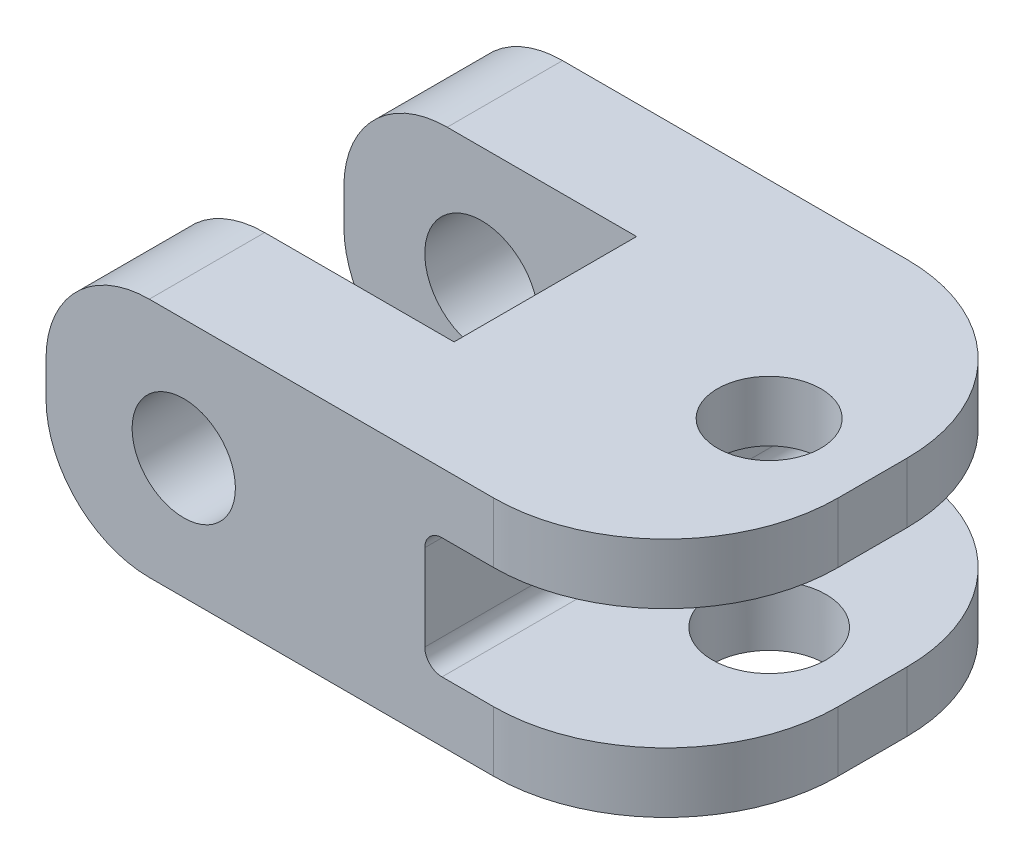
ISO-10303-21;
HEADER;
FILE_DESCRIPTION(('STEP AP214'),'2;1');
FILE_NAME('part.step','',(''),(''),'','','');
FILE_SCHEMA(('AUTOMOTIVE_DESIGN { 1 0 10303 214 1 1 1 1 }'));
ENDSEC;
DATA;
#1=APPLICATION_CONTEXT('core data for automotive mechanical design processes');
#2=APPLICATION_PROTOCOL_DEFINITION('international standard','automotive_design',2000,#1);
#3=PRODUCT_CONTEXT('',#1,'mechanical');
#4=PRODUCT('Part','Part','',(#3));
#5=PRODUCT_RELATED_PRODUCT_CATEGORY('part','',(#4));
#6=PRODUCT_DEFINITION_FORMATION('','',#4);
#7=PRODUCT_DEFINITION_CONTEXT('part definition',#1,'design');
#8=PRODUCT_DEFINITION('design','',#6,#7);
#9=PRODUCT_DEFINITION_SHAPE('','',#8);
#10=(LENGTH_UNIT() NAMED_UNIT(*) SI_UNIT(.MILLI.,.METRE.));
#11=(NAMED_UNIT(*) PLANE_ANGLE_UNIT() SI_UNIT($,.RADIAN.));
#12=(NAMED_UNIT(*) SI_UNIT($,.STERADIAN.) SOLID_ANGLE_UNIT());
#13=UNCERTAINTY_MEASURE_WITH_UNIT(LENGTH_MEASURE(1.E-05),#10,'distance_accuracy_value','');
#14=(GEOMETRIC_REPRESENTATION_CONTEXT(3) GLOBAL_UNCERTAINTY_ASSIGNED_CONTEXT((#13)) GLOBAL_UNIT_ASSIGNED_CONTEXT((#10,
#11,#12)) REPRESENTATION_CONTEXT('',''));
#15=CARTESIAN_POINT('',(0.,0.,0.));
#16=DIRECTION('',(0.,0.,1.));
#17=DIRECTION('',(1.,0.,0.));
#18=AXIS2_PLACEMENT_3D('',#15,#16,#17);
#19=CARTESIAN_POINT('',(9.,3.5,12.));
#20=DIRECTION('',(-1.,0.,0.));
#21=DIRECTION('',(0.,0.,1.));
#22=AXIS2_PLACEMENT_3D('',#19,#20,#21);
#23=PLANE('',#22);
#24=DIRECTION('',(0.,0.,1.));
#25=VECTOR('',#24,1.);
#26=CARTESIAN_POINT('',(9.,-1.75,12.));
#27=LINE('',#26,#25);
#28=CARTESIAN_POINT('',(9.,-1.75,5.));
#29=VERTEX_POINT('',#28);
#30=CARTESIAN_POINT('',(9.,-1.75,7.));
#31=VERTEX_POINT('',#30);
#32=EDGE_CURVE('E268',#29,#31,#27,.T.);
#33=ORIENTED_EDGE('',*,*,#32,.T.);
#34=DIRECTION('',(0.,1.,0.));
#35=VECTOR('',#34,1.);
#36=CARTESIAN_POINT('',(9.,-3.5,7.));
#37=LINE('',#36,#35);
#38=CARTESIAN_POINT('',(9.,-3.5,7.));
#39=VERTEX_POINT('',#38);
#40=EDGE_CURVE('E285',#31,#39,#37,.F.);
#41=ORIENTED_EDGE('',*,*,#40,.T.);
#42=DIRECTION('',(0.,0.,-1.));
#43=VECTOR('',#42,1.);
#44=CARTESIAN_POINT('',(9.,-3.5,12.));
#45=LINE('',#44,#43);
#46=CARTESIAN_POINT('',(9.,-3.5,5.));
#47=VERTEX_POINT('',#46);
#48=EDGE_CURVE('E250',#39,#47,#45,.T.);
#49=ORIENTED_EDGE('',*,*,#48,.T.);
#50=DIRECTION('',(0.,1.,0.));
#51=VECTOR('',#50,1.);
#52=CARTESIAN_POINT('',(9.,3.5,5.));
#53=LINE('',#52,#51);
#54=EDGE_CURVE('E282',#47,#29,#53,.T.);
#55=ORIENTED_EDGE('',*,*,#54,.T.);
#56=EDGE_LOOP('',(#33,#41,#49,#55));
#57=FACE_BOUND('',#56,.T.);
#58=ADVANCED_FACE('F41',(#57),#23,.F.);
#59=CARTESIAN_POINT('',(-9.,3.5,12.));
#60=DIRECTION('',(1.,0.,0.));
#61=DIRECTION('',(0.,0.,-1.));
#62=AXIS2_PLACEMENT_3D('',#59,#60,#61);
#63=PLANE('',#62);
#64=DIRECTION('',(0.,-1.,0.));
#65=VECTOR('',#64,1.);
#66=CARTESIAN_POINT('',(-9.,3.5,0.));
#67=LINE('',#66,#65);
#68=CARTESIAN_POINT('',(-9.,0.500000000000001,0.));
#69=VERTEX_POINT('',#68);
#70=CARTESIAN_POINT('',(-9.,-0.499999999999999,0.));
#71=VERTEX_POINT('',#70);
#72=EDGE_CURVE('E252',#69,#71,#67,.T.);
#73=ORIENTED_EDGE('',*,*,#72,.T.);
#74=DIRECTION('',(0.,0.,-1.));
#75=VECTOR('',#74,1.);
#76=CARTESIAN_POINT('',(-9.,-0.499999999999999,12.));
#77=LINE('',#76,#75);
#78=CARTESIAN_POINT('',(-9.,-0.499999999999999,3.35));
#79=VERTEX_POINT('',#78);
#80=EDGE_CURVE('E336',#71,#79,#77,.F.);
#81=ORIENTED_EDGE('',*,*,#80,.T.);
#82=DIRECTION('',(0.,1.,0.));
#83=VECTOR('',#82,1.);
#84=CARTESIAN_POINT('',(-9.,-8.5,3.35));
#85=LINE('',#84,#83);
#86=CARTESIAN_POINT('',(-9.,0.5,3.35));
#87=VERTEX_POINT('',#86);
#88=EDGE_CURVE('E212',#79,#87,#85,.T.);
#89=ORIENTED_EDGE('',*,*,#88,.T.);
#90=DIRECTION('',(0.,0.,-1.));
#91=VECTOR('',#90,1.);
#92=CARTESIAN_POINT('',(-9.,0.500000000000001,12.));
#93=LINE('',#92,#91);
#94=EDGE_CURVE('E333',#87,#69,#93,.T.);
#95=ORIENTED_EDGE('',*,*,#94,.T.);
#96=EDGE_LOOP('',(#73,#81,#89,#95));
#97=FACE_BOUND('',#96,.T.);
#98=ADVANCED_FACE('F434',(#97),#63,.F.);
#99=CARTESIAN_POINT('',(-5.,0.,12.));
#100=DIRECTION('',(0.,0.,-1.));
#101=DIRECTION('',(-1.,0.,0.));
#102=AXIS2_PLACEMENT_3D('',#99,#100,#101);
#103=CYLINDRICAL_SURFACE('',#102,1.65);
#104=CARTESIAN_POINT('',(-5.,0.,0.));
#105=DIRECTION('',(0.,0.,1.));
#106=DIRECTION('',(1.,0.,0.));
#107=AXIS2_PLACEMENT_3D('',#104,#105,#106);
#108=CIRCLE('',#107,1.65);
#109=CARTESIAN_POINT('',(-3.35,0.,0.));
#110=VERTEX_POINT('',#109);
#111=EDGE_CURVE('E237',#110,#110,#108,.T.);
#112=ORIENTED_EDGE('',*,*,#111,.F.);
#113=EDGE_LOOP('',(#112));
#114=FACE_BOUND('',#113,.T.);
#115=CARTESIAN_POINT('',(-5.,0.,3.35));
#116=DIRECTION('',(0.,0.,1.));
#117=DIRECTION('',(1.,0.,0.));
#118=AXIS2_PLACEMENT_3D('',#115,#116,#117);
#119=CIRCLE('',#118,1.65);
#120=CARTESIAN_POINT('',(-3.35,0.,3.35));
#121=VERTEX_POINT('',#120);
#122=EDGE_CURVE('E228',#121,#121,#119,.T.);
#123=ORIENTED_EDGE('',*,*,#122,.T.);
#124=EDGE_LOOP('',(#123));
#125=FACE_BOUND('',#124,.T.);
#126=ADVANCED_FACE('F455',(#114,#125),#103,.F.);
#127=CARTESIAN_POINT('',(0.,0.,12.));
#128=DIRECTION('',(0.,0.,1.));
#129=DIRECTION('',(1.,0.,0.));
#130=AXIS2_PLACEMENT_3D('',#127,#128,#129);
#131=PLANE('',#130);
#132=DIRECTION('',(0.,-1.,0.));
#133=VECTOR('',#132,1.);
#134=CARTESIAN_POINT('',(-9.,3.5,12.));
#135=LINE('',#134,#133);
#136=CARTESIAN_POINT('',(-9.,0.500000000000001,12.));
#137=VERTEX_POINT('',#136);
#138=CARTESIAN_POINT('',(-9.,-0.499999999999999,12.));
#139=VERTEX_POINT('',#138);
#140=EDGE_CURVE('E244',#137,#139,#135,.T.);
#141=ORIENTED_EDGE('',*,*,#140,.T.);
#142=CARTESIAN_POINT('',(-6.,-0.499999999999999,12.));
#143=DIRECTION('',(0.,0.,1.));
#144=DIRECTION('',(1.,0.,0.));
#145=AXIS2_PLACEMENT_3D('',#142,#143,#144);
#146=CIRCLE('',#145,3.);
#147=CARTESIAN_POINT('',(-6.,-3.5,12.));
#148=VERTEX_POINT('',#147);
#149=EDGE_CURVE('E327',#139,#148,#146,.T.);
#150=ORIENTED_EDGE('',*,*,#149,.T.);
#151=DIRECTION('',(1.,0.,0.));
#152=VECTOR('',#151,1.);
#153=CARTESIAN_POINT('',(-9.,-3.5,12.));
#154=LINE('',#153,#152);
#155=CARTESIAN_POINT('',(4.,-3.5,12.));
#156=VERTEX_POINT('',#155);
#157=EDGE_CURVE('E248',#148,#156,#154,.T.);
#158=ORIENTED_EDGE('',*,*,#157,.T.);
#159=DIRECTION('',(0.,1.,0.));
#160=VECTOR('',#159,1.);
#161=CARTESIAN_POINT('',(4.,-1.75,12.));
#162=LINE('',#161,#160);
#163=CARTESIAN_POINT('',(4.,-1.75,12.));
#164=VERTEX_POINT('',#163);
#165=EDGE_CURVE('E274',#156,#164,#162,.T.);
#166=ORIENTED_EDGE('',*,*,#165,.T.);
#167=DIRECTION('',(1.,0.,0.));
#168=VECTOR('',#167,1.);
#169=CARTESIAN_POINT('',(2.,-1.75,12.));
#170=LINE('',#169,#168);
#171=CARTESIAN_POINT('',(2.5,-1.75,12.));
#172=VERTEX_POINT('',#171);
#173=EDGE_CURVE('E223',#172,#164,#170,.T.);
#174=ORIENTED_EDGE('',*,*,#173,.F.);
#175=CARTESIAN_POINT('',(2.5,-1.25,12.));
#176=DIRECTION('',(0.,0.,1.));
#177=DIRECTION('',(1.,0.,0.));
#178=AXIS2_PLACEMENT_3D('',#175,#176,#177);
#179=CIRCLE('',#178,0.5);
#180=CARTESIAN_POINT('',(2.,-1.25,12.));
#181=VERTEX_POINT('',#180);
#182=EDGE_CURVE('E49',#172,#181,#179,.F.);
#183=ORIENTED_EDGE('',*,*,#182,.T.);
#184=DIRECTION('',(0.,-1.,0.));
#185=VECTOR('',#184,1.);
#186=CARTESIAN_POINT('',(2.,1.75,12.));
#187=LINE('',#186,#185);
#188=CARTESIAN_POINT('',(2.,1.25,12.));
#189=VERTEX_POINT('',#188);
#190=EDGE_CURVE('E363',#189,#181,#187,.T.);
#191=ORIENTED_EDGE('',*,*,#190,.F.);
#192=CARTESIAN_POINT('',(2.5,1.25,12.));
#193=DIRECTION('',(0.,0.,1.));
#194=DIRECTION('',(1.,0.,0.));
#195=AXIS2_PLACEMENT_3D('',#192,#193,#194);
#196=CIRCLE('',#195,0.5);
#197=CARTESIAN_POINT('',(2.5,1.75,12.));
#198=VERTEX_POINT('',#197);
#199=EDGE_CURVE('E354',#189,#198,#196,.F.);
#200=ORIENTED_EDGE('',*,*,#199,.T.);
#201=DIRECTION('',(-1.,0.,0.));
#202=VECTOR('',#201,1.);
#203=CARTESIAN_POINT('',(2.,1.75,12.));
#204=LINE('',#203,#202);
#205=CARTESIAN_POINT('',(4.,1.75,12.));
#206=VERTEX_POINT('',#205);
#207=EDGE_CURVE('E368',#206,#198,#204,.T.);
#208=ORIENTED_EDGE('',*,*,#207,.F.);
#209=DIRECTION('',(0.,1.,0.));
#210=VECTOR('',#209,1.);
#211=CARTESIAN_POINT('',(4.,3.5,12.));
#212=LINE('',#211,#210);
#213=CARTESIAN_POINT('',(4.,3.5,12.));
#214=VERTEX_POINT('',#213);
#215=EDGE_CURVE('E271',#206,#214,#212,.T.);
#216=ORIENTED_EDGE('',*,*,#215,.T.);
#217=DIRECTION('',(-1.,0.,0.));
#218=VECTOR('',#217,1.);
#219=CARTESIAN_POINT('',(-9.,3.5,12.));
#220=LINE('',#219,#218);
#221=CARTESIAN_POINT('',(-6.,3.5,12.));
#222=VERTEX_POINT('',#221);
#223=EDGE_CURVE('E241',#214,#222,#220,.T.);
#224=ORIENTED_EDGE('',*,*,#223,.T.);
#225=CARTESIAN_POINT('',(-6.,0.500000000000001,12.));
#226=DIRECTION('',(0.,0.,1.));
#227=DIRECTION('',(1.,0.,0.));
#228=AXIS2_PLACEMENT_3D('',#225,#226,#227);
#229=CIRCLE('',#228,3.);
#230=EDGE_CURVE('E325',#222,#137,#229,.T.);
#231=ORIENTED_EDGE('',*,*,#230,.T.);
#232=EDGE_LOOP('',(#141,#150,#158,#166,#174,#183,#191,#200,#208,#216,#224,#231));
#233=FACE_BOUND('',#232,.T.);
#234=CARTESIAN_POINT('',(-5.,0.,12.));
#235=DIRECTION('',(0.,0.,1.));
#236=DIRECTION('',(1.,0.,0.));
#237=AXIS2_PLACEMENT_3D('',#234,#235,#236);
#238=CIRCLE('',#237,1.5);
#239=CARTESIAN_POINT('',(-3.5,0.,12.));
#240=VERTEX_POINT('',#239);
#241=EDGE_CURVE('E636',#240,#240,#238,.F.);
#242=ORIENTED_EDGE('',*,*,#241,.T.);
#243=EDGE_LOOP('',(#242));
#244=FACE_BOUND('',#243,.T.);
#245=ADVANCED_FACE('F361',(#233,#244),#131,.T.);
#246=CARTESIAN_POINT('',(0.,0.,0.));
#247=DIRECTION('',(0.,0.,1.));
#248=DIRECTION('',(1.,0.,0.));
#249=AXIS2_PLACEMENT_3D('',#246,#247,#248);
#250=PLANE('',#249);
#251=DIRECTION('',(1.,0.,0.));
#252=VECTOR('',#251,1.);
#253=CARTESIAN_POINT('',(-9.,-3.5,0.));
#254=LINE('',#253,#252);
#255=CARTESIAN_POINT('',(-6.,-3.5,0.));
#256=VERTEX_POINT('',#255);
#257=CARTESIAN_POINT('',(4.,-3.5,0.));
#258=VERTEX_POINT('',#257);
#259=EDGE_CURVE('E245',#256,#258,#254,.T.);
#260=ORIENTED_EDGE('',*,*,#259,.F.);
#261=CARTESIAN_POINT('',(-6.,-0.499999999999999,0.));
#262=DIRECTION('',(0.,0.,1.));
#263=DIRECTION('',(1.,0.,0.));
#264=AXIS2_PLACEMENT_3D('',#261,#262,#263);
#265=CIRCLE('',#264,3.);
#266=EDGE_CURVE('E331',#256,#71,#265,.F.);
#267=ORIENTED_EDGE('',*,*,#266,.T.);
#268=ORIENTED_EDGE('',*,*,#72,.F.);
#269=CARTESIAN_POINT('',(-6.,0.500000000000001,0.));
#270=DIRECTION('',(0.,0.,1.));
#271=DIRECTION('',(1.,0.,0.));
#272=AXIS2_PLACEMENT_3D('',#269,#270,#271);
#273=CIRCLE('',#272,3.);
#274=CARTESIAN_POINT('',(-6.,3.5,0.));
#275=VERTEX_POINT('',#274);
#276=EDGE_CURVE('E329',#69,#275,#273,.F.);
#277=ORIENTED_EDGE('',*,*,#276,.T.);
#278=DIRECTION('',(-1.,0.,0.));
#279=VECTOR('',#278,1.);
#280=CARTESIAN_POINT('',(-9.,3.5,0.));
#281=LINE('',#280,#279);
#282=CARTESIAN_POINT('',(4.,3.5,0.));
#283=VERTEX_POINT('',#282);
#284=EDGE_CURVE('E240',#283,#275,#281,.T.);
#285=ORIENTED_EDGE('',*,*,#284,.F.);
#286=DIRECTION('',(0.,1.,0.));
#287=VECTOR('',#286,1.);
#288=CARTESIAN_POINT('',(4.,0.,0.));
#289=LINE('',#288,#287);
#290=CARTESIAN_POINT('',(4.,1.75,0.));
#291=VERTEX_POINT('',#290);
#292=EDGE_CURVE('E305',#283,#291,#289,.F.);
#293=ORIENTED_EDGE('',*,*,#292,.T.);
#294=DIRECTION('',(-1.,0.,0.));
#295=VECTOR('',#294,1.);
#296=CARTESIAN_POINT('',(2.,1.75,0.));
#297=LINE('',#296,#295);
#298=CARTESIAN_POINT('',(2.5,1.75,0.));
#299=VERTEX_POINT('',#298);
#300=EDGE_CURVE('E645',#291,#299,#297,.T.);
#301=ORIENTED_EDGE('',*,*,#300,.T.);
#302=CARTESIAN_POINT('',(2.5,1.25,0.));
#303=DIRECTION('',(0.,0.,1.));
#304=DIRECTION('',(1.,0.,0.));
#305=AXIS2_PLACEMENT_3D('',#302,#303,#304);
#306=CIRCLE('',#305,0.5);
#307=CARTESIAN_POINT('',(2.,1.25,0.));
#308=VERTEX_POINT('',#307);
#309=EDGE_CURVE('E356',#299,#308,#306,.T.);
#310=ORIENTED_EDGE('',*,*,#309,.T.);
#311=DIRECTION('',(0.,-1.,0.));
#312=VECTOR('',#311,1.);
#313=CARTESIAN_POINT('',(2.,1.75,0.));
#314=LINE('',#313,#312);
#315=CARTESIAN_POINT('',(2.,-1.25,0.));
#316=VERTEX_POINT('',#315);
#317=EDGE_CURVE('E220',#308,#316,#314,.T.);
#318=ORIENTED_EDGE('',*,*,#317,.T.);
#319=CARTESIAN_POINT('',(2.5,-1.25,0.));
#320=DIRECTION('',(0.,0.,1.));
#321=DIRECTION('',(1.,0.,0.));
#322=AXIS2_PLACEMENT_3D('',#319,#320,#321);
#323=CIRCLE('',#322,0.5);
#324=CARTESIAN_POINT('',(2.5,-1.75,0.));
#325=VERTEX_POINT('',#324);
#326=EDGE_CURVE('E11',#316,#325,#323,.T.);
#327=ORIENTED_EDGE('',*,*,#326,.T.);
#328=DIRECTION('',(1.,0.,0.));
#329=VECTOR('',#328,1.);
#330=CARTESIAN_POINT('',(2.,-1.75,0.));
#331=LINE('',#330,#329);
#332=CARTESIAN_POINT('',(4.,-1.75,0.));
#333=VERTEX_POINT('',#332);
#334=EDGE_CURVE('E218',#325,#333,#331,.T.);
#335=ORIENTED_EDGE('',*,*,#334,.T.);
#336=DIRECTION('',(0.,1.,0.));
#337=VECTOR('',#336,1.);
#338=CARTESIAN_POINT('',(4.,0.,0.));
#339=LINE('',#338,#337);
#340=EDGE_CURVE('E307',#333,#258,#339,.F.);
#341=ORIENTED_EDGE('',*,*,#340,.T.);
#342=EDGE_LOOP('',(#260,#267,#268,#277,#285,#293,#301,#310,#318,#327,#335,#341));
#343=FACE_BOUND('',#342,.T.);
#344=ORIENTED_EDGE('',*,*,#111,.T.);
#345=EDGE_LOOP('',(#344));
#346=FACE_BOUND('',#345,.T.);
#347=ADVANCED_FACE('F375',(#343,#346),#250,.F.);
#348=DIRECTION('',(0.,0.,-1.));
#349=VECTOR('',#348,1.);
#350=CARTESIAN_POINT('',(9.,3.5,12.));
#351=LINE('',#350,#349);
#352=CARTESIAN_POINT('',(9.,3.5,7.));
#353=VERTEX_POINT('',#352);
#354=CARTESIAN_POINT('',(9.,3.5,5.));
#355=VERTEX_POINT('',#354);
#356=EDGE_CURVE('E258',#353,#355,#351,.T.);
#357=ORIENTED_EDGE('',*,*,#356,.F.);
#358=DIRECTION('',(0.,1.,0.));
#359=VECTOR('',#358,1.);
#360=CARTESIAN_POINT('',(9.,1.75,7.));
#361=LINE('',#360,#359);
#362=CARTESIAN_POINT('',(9.,1.75,7.));
#363=VERTEX_POINT('',#362);
#364=EDGE_CURVE('E299',#353,#363,#361,.F.);
#365=ORIENTED_EDGE('',*,*,#364,.T.);
#366=DIRECTION('',(0.,0.,-1.));
#367=VECTOR('',#366,1.);
#368=CARTESIAN_POINT('',(9.,1.75,12.));
#369=LINE('',#368,#367);
#370=CARTESIAN_POINT('',(9.,1.75,5.));
#371=VERTEX_POINT('',#370);
#372=EDGE_CURVE('E265',#363,#371,#369,.T.);
#373=ORIENTED_EDGE('',*,*,#372,.T.);
#374=DIRECTION('',(0.,1.,0.));
#375=VECTOR('',#374,1.);
#376=CARTESIAN_POINT('',(9.,3.5,5.));
#377=LINE('',#376,#375);
#378=EDGE_CURVE('E296',#371,#355,#377,.T.);
#379=ORIENTED_EDGE('',*,*,#378,.T.);
#380=EDGE_LOOP('',(#357,#365,#373,#379));
#381=FACE_BOUND('',#380,.T.);
#382=ADVANCED_FACE('F419',(#381),#23,.F.);
#383=CARTESIAN_POINT('',(-9.,3.5,12.));
#384=DIRECTION('',(0.,-1.,0.));
#385=DIRECTION('',(0.,0.,-1.));
#386=AXIS2_PLACEMENT_3D('',#383,#384,#385);
#387=PLANE('',#386);
#388=DIRECTION('',(1.,0.,0.));
#389=VECTOR('',#388,1.);
#390=CARTESIAN_POINT('',(0.,3.5,8.65));
#391=LINE('',#390,#389);
#392=CARTESIAN_POINT('',(-6.,3.5,8.65));
#393=VERTEX_POINT('',#392);
#394=CARTESIAN_POINT('',(-0.499999999999999,3.5,8.65));
#395=VERTEX_POINT('',#394);
#396=EDGE_CURVE('E201',#393,#395,#391,.T.);
#397=ORIENTED_EDGE('',*,*,#396,.F.);
#398=DIRECTION('',(0.,0.,-1.));
#399=VECTOR('',#398,1.);
#400=CARTESIAN_POINT('',(-6.,3.5,12.));
#401=LINE('',#400,#399);
#402=EDGE_CURVE('E343',#393,#222,#401,.F.);
#403=ORIENTED_EDGE('',*,*,#402,.T.);
#404=ORIENTED_EDGE('',*,*,#223,.F.);
#405=CARTESIAN_POINT('',(4.,3.5,7.));
#406=DIRECTION('',(0.,-1.,0.));
#407=DIRECTION('',(0.,0.,-1.));
#408=AXIS2_PLACEMENT_3D('',#405,#406,#407);
#409=CIRCLE('',#408,5.);
#410=EDGE_CURVE('E294',#214,#353,#409,.F.);
#411=ORIENTED_EDGE('',*,*,#410,.T.);
#412=ORIENTED_EDGE('',*,*,#356,.T.);
#413=CARTESIAN_POINT('',(4.,3.5,5.));
#414=DIRECTION('',(0.,-1.,0.));
#415=DIRECTION('',(0.,0.,-1.));
#416=AXIS2_PLACEMENT_3D('',#413,#414,#415);
#417=CIRCLE('',#416,5.);
#418=EDGE_CURVE('E292',#355,#283,#417,.F.);
#419=ORIENTED_EDGE('',*,*,#418,.T.);
#420=ORIENTED_EDGE('',*,*,#284,.T.);
#421=DIRECTION('',(0.,0.,-1.));
#422=VECTOR('',#421,1.);
#423=CARTESIAN_POINT('',(-6.,3.5,12.));
#424=LINE('',#423,#422);
#425=CARTESIAN_POINT('',(-6.,3.5,3.35));
#426=VERTEX_POINT('',#425);
#427=EDGE_CURVE('E198',#275,#426,#424,.F.);
#428=ORIENTED_EDGE('',*,*,#427,.T.);
#429=DIRECTION('',(1.,0.,0.));
#430=VECTOR('',#429,1.);
#431=CARTESIAN_POINT('',(0.,3.5,3.35));
#432=LINE('',#431,#430);
#433=CARTESIAN_POINT('',(-0.499999999999999,3.5,3.35));
#434=VERTEX_POINT('',#433);
#435=EDGE_CURVE('E189',#426,#434,#432,.T.);
#436=ORIENTED_EDGE('',*,*,#435,.T.);
#437=DIRECTION('',(0.,0.,1.));
#438=VECTOR('',#437,1.);
#439=CARTESIAN_POINT('',(-0.499999999999999,3.5,0.));
#440=LINE('',#439,#438);
#441=EDGE_CURVE('E195',#434,#395,#440,.T.);
#442=ORIENTED_EDGE('',*,*,#441,.T.);
#443=EDGE_LOOP('',(#397,#403,#404,#411,#412,#419,#420,#428,#436,#442));
#444=FACE_BOUND('',#443,.T.);
#445=CARTESIAN_POINT('',(6.,3.5,6.));
#446=DIRECTION('',(0.,-1.,0.));
#447=DIRECTION('',(0.,0.,-1.));
#448=AXIS2_PLACEMENT_3D('',#445,#446,#447);
#449=CIRCLE('',#448,1.5);
#450=CARTESIAN_POINT('',(6.,3.5,4.5));
#451=VERTEX_POINT('',#450);
#452=EDGE_CURVE('E654',#451,#451,#449,.F.);
#453=ORIENTED_EDGE('',*,*,#452,.F.);
#454=EDGE_LOOP('',(#453));
#455=FACE_BOUND('',#454,.T.);
#456=ADVANCED_FACE('F192',(#444,#455),#387,.F.);
#457=DIRECTION('',(0.,1.,0.));
#458=VECTOR('',#457,1.);
#459=CARTESIAN_POINT('',(-9.,-8.5,8.65));
#460=LINE('',#459,#458);
#461=CARTESIAN_POINT('',(-9.,-0.499999999999999,8.65));
#462=VERTEX_POINT('',#461);
#463=CARTESIAN_POINT('',(-9.,0.5,8.65));
#464=VERTEX_POINT('',#463);
#465=EDGE_CURVE('E229',#462,#464,#460,.T.);
#466=ORIENTED_EDGE('',*,*,#465,.F.);
#467=DIRECTION('',(0.,0.,-1.));
#468=VECTOR('',#467,1.);
#469=CARTESIAN_POINT('',(-9.,-0.499999999999999,12.));
#470=LINE('',#469,#468);
#471=EDGE_CURVE('E323',#462,#139,#470,.F.);
#472=ORIENTED_EDGE('',*,*,#471,.T.);
#473=ORIENTED_EDGE('',*,*,#140,.F.);
#474=DIRECTION('',(0.,0.,-1.));
#475=VECTOR('',#474,1.);
#476=CARTESIAN_POINT('',(-9.,0.500000000000001,12.));
#477=LINE('',#476,#475);
#478=EDGE_CURVE('E320',#137,#464,#477,.T.);
#479=ORIENTED_EDGE('',*,*,#478,.T.);
#480=EDGE_LOOP('',(#466,#472,#473,#479));
#481=FACE_BOUND('',#480,.T.);
#482=ADVANCED_FACE('F402',(#481),#63,.F.);
#483=CARTESIAN_POINT('',(-9.,-3.5,12.));
#484=DIRECTION('',(0.,1.,0.));
#485=DIRECTION('',(0.,0.,1.));
#486=AXIS2_PLACEMENT_3D('',#483,#484,#485);
#487=PLANE('',#486);
#488=CARTESIAN_POINT('',(6.,-3.5,6.));
#489=DIRECTION('',(0.,1.,0.));
#490=DIRECTION('',(0.,0.,1.));
#491=AXIS2_PLACEMENT_3D('',#488,#489,#490);
#492=CIRCLE('',#491,1.65);
#493=CARTESIAN_POINT('',(6.,-3.5,7.65));
#494=VERTEX_POINT('',#493);
#495=EDGE_CURVE('E635',#494,#494,#492,.T.);
#496=ORIENTED_EDGE('',*,*,#495,.T.);
#497=EDGE_LOOP('',(#496));
#498=FACE_BOUND('',#497,.T.);
#499=ORIENTED_EDGE('',*,*,#157,.F.);
#500=DIRECTION('',(0.,0.,-1.));
#501=VECTOR('',#500,1.);
#502=CARTESIAN_POINT('',(-6.,-3.5,12.));
#503=LINE('',#502,#501);
#504=CARTESIAN_POINT('',(-6.,-3.5,8.65));
#505=VERTEX_POINT('',#504);
#506=EDGE_CURVE('E313',#148,#505,#503,.T.);
#507=ORIENTED_EDGE('',*,*,#506,.T.);
#508=DIRECTION('',(1.,0.,0.));
#509=VECTOR('',#508,1.);
#510=CARTESIAN_POINT('',(-9.,-3.5,8.65));
#511=LINE('',#510,#509);
#512=CARTESIAN_POINT('',(-0.499999999999999,-3.5,8.65));
#513=VERTEX_POINT('',#512);
#514=EDGE_CURVE('E235',#505,#513,#511,.T.);
#515=ORIENTED_EDGE('',*,*,#514,.T.);
#516=DIRECTION('',(0.,0.,1.));
#517=VECTOR('',#516,1.);
#518=CARTESIAN_POINT('',(-0.499999999999999,-3.5,12.));
#519=LINE('',#518,#517);
#520=CARTESIAN_POINT('',(-0.499999999999999,-3.5,3.35));
#521=VERTEX_POINT('',#520);
#522=EDGE_CURVE('E261',#521,#513,#519,.T.);
#523=ORIENTED_EDGE('',*,*,#522,.F.);
#524=DIRECTION('',(1.,0.,0.));
#525=VECTOR('',#524,1.);
#526=CARTESIAN_POINT('',(-9.,-3.5,3.35));
#527=LINE('',#526,#525);
#528=CARTESIAN_POINT('',(-6.,-3.5,3.35));
#529=VERTEX_POINT('',#528);
#530=EDGE_CURVE('E208',#529,#521,#527,.T.);
#531=ORIENTED_EDGE('',*,*,#530,.F.);
#532=DIRECTION('',(0.,0.,-1.));
#533=VECTOR('',#532,1.);
#534=CARTESIAN_POINT('',(-6.,-3.5,12.));
#535=LINE('',#534,#533);
#536=EDGE_CURVE('E310',#529,#256,#535,.T.);
#537=ORIENTED_EDGE('',*,*,#536,.T.);
#538=ORIENTED_EDGE('',*,*,#259,.T.);
#539=CARTESIAN_POINT('',(4.,-3.5,5.));
#540=DIRECTION('',(0.,1.,0.));
#541=DIRECTION('',(0.,0.,1.));
#542=AXIS2_PLACEMENT_3D('',#539,#540,#541);
#543=CIRCLE('',#542,5.);
#544=EDGE_CURVE('E287',#258,#47,#543,.F.);
#545=ORIENTED_EDGE('',*,*,#544,.T.);
#546=ORIENTED_EDGE('',*,*,#48,.F.);
#547=CARTESIAN_POINT('',(4.,-3.5,7.));
#548=DIRECTION('',(0.,1.,0.));
#549=DIRECTION('',(0.,0.,1.));
#550=AXIS2_PLACEMENT_3D('',#547,#548,#549);
#551=CIRCLE('',#550,5.);
#552=EDGE_CURVE('E289',#39,#156,#551,.F.);
#553=ORIENTED_EDGE('',*,*,#552,.T.);
#554=EDGE_LOOP('',(#499,#507,#515,#523,#531,#537,#538,#545,#546,#553));
#555=FACE_BOUND('',#554,.T.);
#556=ADVANCED_FACE('F384',(#498,#555),#487,.F.);
#557=CARTESIAN_POINT('',(-0.499999999999999,-8.5,0.));
#558=DIRECTION('',(-1.,0.,0.));
#559=DIRECTION('',(0.,0.,1.));
#560=AXIS2_PLACEMENT_3D('',#557,#558,#559);
#561=PLANE('',#560);
#562=ORIENTED_EDGE('',*,*,#522,.T.);
#563=DIRECTION('',(0.,1.,0.));
#564=VECTOR('',#563,1.);
#565=CARTESIAN_POINT('',(-0.499999999999999,-8.5,8.65));
#566=LINE('',#565,#564);
#567=EDGE_CURVE('E217',#513,#395,#566,.T.);
#568=ORIENTED_EDGE('',*,*,#567,.T.);
#569=ORIENTED_EDGE('',*,*,#441,.F.);
#570=DIRECTION('',(0.,1.,0.));
#571=VECTOR('',#570,1.);
#572=CARTESIAN_POINT('',(-0.499999999999999,-8.5,3.35));
#573=LINE('',#572,#571);
#574=EDGE_CURVE('E204',#521,#434,#573,.T.);
#575=ORIENTED_EDGE('',*,*,#574,.F.);
#576=EDGE_LOOP('',(#562,#568,#569,#575));
#577=FACE_BOUND('',#576,.T.);
#578=ADVANCED_FACE('F215',(#577),#561,.T.);
#579=CARTESIAN_POINT('',(0.,-8.5,8.65));
#580=DIRECTION('',(0.,0.,1.));
#581=DIRECTION('',(1.,0.,0.));
#582=AXIS2_PLACEMENT_3D('',#579,#580,#581);
#583=PLANE('',#582);
#584=ORIENTED_EDGE('',*,*,#514,.F.);
#585=CARTESIAN_POINT('',(-6.,-0.499999999999999,8.65));
#586=DIRECTION('',(0.,0.,1.));
#587=DIRECTION('',(1.,0.,0.));
#588=AXIS2_PLACEMENT_3D('',#585,#586,#587);
#589=CIRCLE('',#588,3.);
#590=EDGE_CURVE('E318',#505,#462,#589,.F.);
#591=ORIENTED_EDGE('',*,*,#590,.T.);
#592=ORIENTED_EDGE('',*,*,#465,.T.);
#593=CARTESIAN_POINT('',(-6.,0.500000000000001,8.65));
#594=DIRECTION('',(0.,0.,1.));
#595=DIRECTION('',(1.,0.,0.));
#596=AXIS2_PLACEMENT_3D('',#593,#594,#595);
#597=CIRCLE('',#596,3.);
#598=EDGE_CURVE('E316',#464,#393,#597,.F.);
#599=ORIENTED_EDGE('',*,*,#598,.T.);
#600=ORIENTED_EDGE('',*,*,#396,.T.);
#601=ORIENTED_EDGE('',*,*,#567,.F.);
#602=EDGE_LOOP('',(#584,#591,#592,#599,#600,#601));
#603=FACE_BOUND('',#602,.T.);
#604=CARTESIAN_POINT('',(-5.,0.,8.65));
#605=DIRECTION('',(0.,0.,-1.));
#606=DIRECTION('',(-1.,0.,0.));
#607=AXIS2_PLACEMENT_3D('',#604,#605,#606);
#608=CIRCLE('',#607,1.5);
#609=CARTESIAN_POINT('',(-6.5,0.,8.65));
#610=VERTEX_POINT('',#609);
#611=EDGE_CURVE('E641',#610,#610,#608,.T.);
#612=ORIENTED_EDGE('',*,*,#611,.F.);
#613=EDGE_LOOP('',(#612));
#614=FACE_BOUND('',#613,.T.);
#615=ADVANCED_FACE('F399',(#603,#614),#583,.F.);
#616=CARTESIAN_POINT('',(0.,-8.5,3.35));
#617=DIRECTION('',(0.,0.,1.));
#618=DIRECTION('',(1.,0.,0.));
#619=AXIS2_PLACEMENT_3D('',#616,#617,#618);
#620=PLANE('',#619);
#621=ORIENTED_EDGE('',*,*,#122,.F.);
#622=EDGE_LOOP('',(#621));
#623=FACE_BOUND('',#622,.T.);
#624=ORIENTED_EDGE('',*,*,#88,.F.);
#625=CARTESIAN_POINT('',(-6.,-0.499999999999999,3.35));
#626=DIRECTION('',(0.,0.,1.));
#627=DIRECTION('',(1.,0.,0.));
#628=AXIS2_PLACEMENT_3D('',#625,#626,#627);
#629=CIRCLE('',#628,3.);
#630=EDGE_CURVE('E340',#79,#529,#629,.T.);
#631=ORIENTED_EDGE('',*,*,#630,.T.);
#632=ORIENTED_EDGE('',*,*,#530,.T.);
#633=ORIENTED_EDGE('',*,*,#574,.T.);
#634=ORIENTED_EDGE('',*,*,#435,.F.);
#635=CARTESIAN_POINT('',(-6.,0.500000000000001,3.35));
#636=DIRECTION('',(0.,0.,1.));
#637=DIRECTION('',(1.,0.,0.));
#638=AXIS2_PLACEMENT_3D('',#635,#636,#637);
#639=CIRCLE('',#638,3.);
#640=EDGE_CURVE('E338',#426,#87,#639,.T.);
#641=ORIENTED_EDGE('',*,*,#640,.T.);
#642=EDGE_LOOP('',(#624,#631,#632,#633,#634,#641));
#643=FACE_BOUND('',#642,.T.);
#644=ADVANCED_FACE('F206',(#623,#643),#620,.T.);
#645=CARTESIAN_POINT('',(2.,-1.75,0.));
#646=DIRECTION('',(0.,-1.,0.));
#647=DIRECTION('',(0.,0.,-1.));
#648=AXIS2_PLACEMENT_3D('',#645,#646,#647);
#649=PLANE('',#648);
#650=CARTESIAN_POINT('',(6.,-1.75,6.));
#651=DIRECTION('',(0.,-1.,0.));
#652=DIRECTION('',(0.,0.,-1.));
#653=AXIS2_PLACEMENT_3D('',#650,#651,#652);
#654=CIRCLE('',#653,1.65);
#655=CARTESIAN_POINT('',(6.,-1.75,4.35));
#656=VERTEX_POINT('',#655);
#657=EDGE_CURVE('E634',#656,#656,#654,.T.);
#658=ORIENTED_EDGE('',*,*,#657,.T.);
#659=EDGE_LOOP('',(#658));
#660=FACE_BOUND('',#659,.T.);
#661=ORIENTED_EDGE('',*,*,#334,.F.);
#662=DIRECTION('',(0.,0.,1.));
#663=VECTOR('',#662,1.);
#664=CARTESIAN_POINT('',(2.5,-1.75,12.));
#665=LINE('',#664,#663);
#666=EDGE_CURVE('E352',#325,#172,#665,.T.);
#667=ORIENTED_EDGE('',*,*,#666,.T.);
#668=ORIENTED_EDGE('',*,*,#173,.T.);
#669=CARTESIAN_POINT('',(4.,-1.75,7.));
#670=DIRECTION('',(0.,-1.,0.));
#671=DIRECTION('',(0.,0.,-1.));
#672=AXIS2_PLACEMENT_3D('',#669,#670,#671);
#673=CIRCLE('',#672,5.);
#674=EDGE_CURVE('E280',#164,#31,#673,.F.);
#675=ORIENTED_EDGE('',*,*,#674,.T.);
#676=ORIENTED_EDGE('',*,*,#32,.F.);
#677=CARTESIAN_POINT('',(4.,-1.75,5.));
#678=DIRECTION('',(0.,-1.,0.));
#679=DIRECTION('',(0.,0.,-1.));
#680=AXIS2_PLACEMENT_3D('',#677,#678,#679);
#681=CIRCLE('',#680,5.);
#682=EDGE_CURVE('E277',#29,#333,#681,.F.);
#683=ORIENTED_EDGE('',*,*,#682,.T.);
#684=EDGE_LOOP('',(#661,#667,#668,#675,#676,#683));
#685=FACE_BOUND('',#684,.T.);
#686=ADVANCED_FACE('F370',(#660,#685),#649,.F.);
#687=CARTESIAN_POINT('',(2.,1.75,0.));
#688=DIRECTION('',(0.,1.,0.));
#689=DIRECTION('',(0.,0.,1.));
#690=AXIS2_PLACEMENT_3D('',#687,#688,#689);
#691=PLANE('',#690);
#692=ORIENTED_EDGE('',*,*,#207,.T.);
#693=DIRECTION('',(0.,0.,1.));
#694=VECTOR('',#693,1.);
#695=CARTESIAN_POINT('',(2.5,1.75,0.));
#696=LINE('',#695,#694);
#697=EDGE_CURVE('E350',#198,#299,#696,.F.);
#698=ORIENTED_EDGE('',*,*,#697,.T.);
#699=ORIENTED_EDGE('',*,*,#300,.F.);
#700=CARTESIAN_POINT('',(4.,1.75,5.));
#701=DIRECTION('',(0.,1.,0.));
#702=DIRECTION('',(0.,0.,1.));
#703=AXIS2_PLACEMENT_3D('',#700,#701,#702);
#704=CIRCLE('',#703,5.);
#705=EDGE_CURVE('E301',#291,#371,#704,.F.);
#706=ORIENTED_EDGE('',*,*,#705,.T.);
#707=ORIENTED_EDGE('',*,*,#372,.F.);
#708=CARTESIAN_POINT('',(4.,1.75,7.));
#709=DIRECTION('',(0.,1.,0.));
#710=DIRECTION('',(0.,0.,1.));
#711=AXIS2_PLACEMENT_3D('',#708,#709,#710);
#712=CIRCLE('',#711,5.);
#713=EDGE_CURVE('E303',#363,#206,#712,.F.);
#714=ORIENTED_EDGE('',*,*,#713,.T.);
#715=EDGE_LOOP('',(#692,#698,#699,#706,#707,#714));
#716=FACE_BOUND('',#715,.T.);
#717=CARTESIAN_POINT('',(6.,1.75,6.));
#718=DIRECTION('',(0.,-1.,0.));
#719=DIRECTION('',(0.,0.,-1.));
#720=AXIS2_PLACEMENT_3D('',#717,#718,#719);
#721=CIRCLE('',#720,1.5);
#722=CARTESIAN_POINT('',(6.,1.75,4.5));
#723=VERTEX_POINT('',#722);
#724=EDGE_CURVE('E653',#723,#723,#721,.T.);
#725=ORIENTED_EDGE('',*,*,#724,.F.);
#726=EDGE_LOOP('',(#725));
#727=FACE_BOUND('',#726,.T.);
#728=ADVANCED_FACE('F562',(#716,#727),#691,.F.);
#729=CARTESIAN_POINT('',(2.,1.75,0.));
#730=DIRECTION('',(-1.,0.,0.));
#731=DIRECTION('',(0.,-1.,0.));
#732=AXIS2_PLACEMENT_3D('',#729,#730,#731);
#733=PLANE('',#732);
#734=ORIENTED_EDGE('',*,*,#317,.F.);
#735=DIRECTION('',(0.,0.,1.));
#736=VECTOR('',#735,1.);
#737=CARTESIAN_POINT('',(2.,1.25,12.));
#738=LINE('',#737,#736);
#739=EDGE_CURVE('E347',#308,#189,#738,.T.);
#740=ORIENTED_EDGE('',*,*,#739,.T.);
#741=ORIENTED_EDGE('',*,*,#190,.T.);
#742=DIRECTION('',(0.,0.,1.));
#743=VECTOR('',#742,1.);
#744=CARTESIAN_POINT('',(2.,-1.25,0.));
#745=LINE('',#744,#743);
#746=EDGE_CURVE('E345',#181,#316,#745,.F.);
#747=ORIENTED_EDGE('',*,*,#746,.T.);
#748=EDGE_LOOP('',(#734,#740,#741,#747));
#749=FACE_BOUND('',#748,.T.);
#750=ADVANCED_FACE('F366',(#749),#733,.F.);
#751=CARTESIAN_POINT('',(6.,-8.5,6.));
#752=DIRECTION('',(0.,1.,0.));
#753=DIRECTION('',(0.,0.,1.));
#754=AXIS2_PLACEMENT_3D('',#751,#752,#753);
#755=CYLINDRICAL_SURFACE('',#754,1.65);
#756=ORIENTED_EDGE('',*,*,#657,.F.);
#757=EDGE_LOOP('',(#756));
#758=FACE_BOUND('',#757,.T.);
#759=ORIENTED_EDGE('',*,*,#495,.F.);
#760=EDGE_LOOP('',(#759));
#761=FACE_BOUND('',#760,.T.);
#762=ADVANCED_FACE('F583',(#758,#761),#755,.F.);
#763=CARTESIAN_POINT('',(4.,0.,7.));
#764=DIRECTION('',(0.,-1.,0.));
#765=DIRECTION('',(0.,0.,-1.));
#766=AXIS2_PLACEMENT_3D('',#763,#764,#765);
#767=CYLINDRICAL_SURFACE('',#766,5.);
#768=ORIENTED_EDGE('',*,*,#552,.F.);
#769=ORIENTED_EDGE('',*,*,#40,.F.);
#770=ORIENTED_EDGE('',*,*,#674,.F.);
#771=ORIENTED_EDGE('',*,*,#165,.F.);
#772=EDGE_LOOP('',(#768,#769,#770,#771));
#773=FACE_BOUND('',#772,.T.);
#774=ADVANCED_FACE('F389',(#773),#767,.T.);
#775=CARTESIAN_POINT('',(4.,0.,7.));
#776=DIRECTION('',(0.,-1.,0.));
#777=DIRECTION('',(0.,0.,-1.));
#778=AXIS2_PLACEMENT_3D('',#775,#776,#777);
#779=CYLINDRICAL_SURFACE('',#778,5.);
#780=ORIENTED_EDGE('',*,*,#713,.F.);
#781=ORIENTED_EDGE('',*,*,#364,.F.);
#782=ORIENTED_EDGE('',*,*,#410,.F.);
#783=ORIENTED_EDGE('',*,*,#215,.F.);
#784=EDGE_LOOP('',(#780,#781,#782,#783));
#785=FACE_BOUND('',#784,.T.);
#786=ADVANCED_FACE('F415',(#785),#779,.T.);
#787=CARTESIAN_POINT('',(4.,3.5,5.));
#788=DIRECTION('',(0.,1.,0.));
#789=DIRECTION('',(0.,0.,1.));
#790=AXIS2_PLACEMENT_3D('',#787,#788,#789);
#791=CYLINDRICAL_SURFACE('',#790,5.);
#792=ORIENTED_EDGE('',*,*,#544,.F.);
#793=ORIENTED_EDGE('',*,*,#340,.F.);
#794=ORIENTED_EDGE('',*,*,#682,.F.);
#795=ORIENTED_EDGE('',*,*,#54,.F.);
#796=EDGE_LOOP('',(#792,#793,#794,#795));
#797=FACE_BOUND('',#796,.T.);
#798=ADVANCED_FACE('F380',(#797),#791,.T.);
#799=CARTESIAN_POINT('',(4.,3.5,5.));
#800=DIRECTION('',(0.,1.,0.));
#801=DIRECTION('',(0.,0.,1.));
#802=AXIS2_PLACEMENT_3D('',#799,#800,#801);
#803=CYLINDRICAL_SURFACE('',#802,5.);
#804=ORIENTED_EDGE('',*,*,#705,.F.);
#805=ORIENTED_EDGE('',*,*,#292,.F.);
#806=ORIENTED_EDGE('',*,*,#418,.F.);
#807=ORIENTED_EDGE('',*,*,#378,.F.);
#808=EDGE_LOOP('',(#804,#805,#806,#807));
#809=FACE_BOUND('',#808,.T.);
#810=ADVANCED_FACE('F424',(#809),#803,.T.);
#811=CARTESIAN_POINT('',(-6.,-0.499999999999999,12.));
#812=DIRECTION('',(0.,0.,-1.));
#813=DIRECTION('',(-1.,0.,0.));
#814=AXIS2_PLACEMENT_3D('',#811,#812,#813);
#815=CYLINDRICAL_SURFACE('',#814,3.);
#816=ORIENTED_EDGE('',*,*,#149,.F.);
#817=ORIENTED_EDGE('',*,*,#471,.F.);
#818=ORIENTED_EDGE('',*,*,#590,.F.);
#819=ORIENTED_EDGE('',*,*,#506,.F.);
#820=EDGE_LOOP('',(#816,#817,#818,#819));
#821=FACE_BOUND('',#820,.T.);
#822=ADVANCED_FACE('F395',(#821),#815,.T.);
#823=CARTESIAN_POINT('',(-6.,-0.499999999999999,12.));
#824=DIRECTION('',(0.,0.,-1.));
#825=DIRECTION('',(-1.,0.,0.));
#826=AXIS2_PLACEMENT_3D('',#823,#824,#825);
#827=CYLINDRICAL_SURFACE('',#826,3.);
#828=ORIENTED_EDGE('',*,*,#630,.F.);
#829=ORIENTED_EDGE('',*,*,#80,.F.);
#830=ORIENTED_EDGE('',*,*,#266,.F.);
#831=ORIENTED_EDGE('',*,*,#536,.F.);
#832=EDGE_LOOP('',(#828,#829,#830,#831));
#833=FACE_BOUND('',#832,.T.);
#834=ADVANCED_FACE('F439',(#833),#827,.T.);
#835=CARTESIAN_POINT('',(-6.,0.500000000000001,12.));
#836=DIRECTION('',(0.,0.,-1.));
#837=DIRECTION('',(-1.,0.,0.));
#838=AXIS2_PLACEMENT_3D('',#835,#836,#837);
#839=CYLINDRICAL_SURFACE('',#838,3.);
#840=ORIENTED_EDGE('',*,*,#230,.F.);
#841=ORIENTED_EDGE('',*,*,#402,.F.);
#842=ORIENTED_EDGE('',*,*,#598,.F.);
#843=ORIENTED_EDGE('',*,*,#478,.F.);
#844=EDGE_LOOP('',(#840,#841,#842,#843));
#845=FACE_BOUND('',#844,.T.);
#846=ADVANCED_FACE('F407',(#845),#839,.T.);
#847=CARTESIAN_POINT('',(-6.,0.500000000000001,12.));
#848=DIRECTION('',(0.,0.,-1.));
#849=DIRECTION('',(-1.,0.,0.));
#850=AXIS2_PLACEMENT_3D('',#847,#848,#849);
#851=CYLINDRICAL_SURFACE('',#850,3.);
#852=ORIENTED_EDGE('',*,*,#640,.F.);
#853=ORIENTED_EDGE('',*,*,#427,.F.);
#854=ORIENTED_EDGE('',*,*,#276,.F.);
#855=ORIENTED_EDGE('',*,*,#94,.F.);
#856=EDGE_LOOP('',(#852,#853,#854,#855));
#857=FACE_BOUND('',#856,.T.);
#858=ADVANCED_FACE('F432',(#857),#851,.T.);
#859=CARTESIAN_POINT('',(2.5,1.25,0.));
#860=DIRECTION('',(0.,0.,-1.));
#861=DIRECTION('',(-1.,0.,0.));
#862=AXIS2_PLACEMENT_3D('',#859,#860,#861);
#863=CYLINDRICAL_SURFACE('',#862,0.5);
#864=ORIENTED_EDGE('',*,*,#309,.F.);
#865=ORIENTED_EDGE('',*,*,#697,.F.);
#866=ORIENTED_EDGE('',*,*,#199,.F.);
#867=ORIENTED_EDGE('',*,*,#739,.F.);
#868=EDGE_LOOP('',(#864,#865,#866,#867));
#869=FACE_BOUND('',#868,.T.);
#870=ADVANCED_FACE('F515',(#869),#863,.F.);
#871=CARTESIAN_POINT('',(2.5,-1.25,0.));
#872=DIRECTION('',(0.,0.,-1.));
#873=DIRECTION('',(-1.,0.,0.));
#874=AXIS2_PLACEMENT_3D('',#871,#872,#873);
#875=CYLINDRICAL_SURFACE('',#874,0.5);
#876=ORIENTED_EDGE('',*,*,#326,.F.);
#877=ORIENTED_EDGE('',*,*,#746,.F.);
#878=ORIENTED_EDGE('',*,*,#182,.F.);
#879=ORIENTED_EDGE('',*,*,#666,.F.);
#880=EDGE_LOOP('',(#876,#877,#878,#879));
#881=FACE_BOUND('',#880,.T.);
#882=ADVANCED_FACE('F43',(#881),#875,.F.);
#883=CARTESIAN_POINT('',(-5.,0.,16.6669047558312));
#884=DIRECTION('',(0.,0.,-1.));
#885=DIRECTION('',(-1.,0.,0.));
#886=AXIS2_PLACEMENT_3D('',#883,#884,#885);
#887=CYLINDRICAL_SURFACE('',#886,1.5);
#888=ORIENTED_EDGE('',*,*,#611,.T.);
#889=EDGE_LOOP('',(#888));
#890=FACE_BOUND('',#889,.T.);
#891=ORIENTED_EDGE('',*,*,#241,.F.);
#892=EDGE_LOOP('',(#891));
#893=FACE_BOUND('',#892,.T.);
#894=ADVANCED_FACE('F529',(#890,#893),#887,.F.);
#895=CARTESIAN_POINT('',(6.,8.16690475583121,6.));
#896=DIRECTION('',(0.,-1.,0.));
#897=DIRECTION('',(0.,0.,-1.));
#898=AXIS2_PLACEMENT_3D('',#895,#896,#897);
#899=CYLINDRICAL_SURFACE('',#898,1.5);
#900=ORIENTED_EDGE('',*,*,#452,.T.);
#901=EDGE_LOOP('',(#900));
#902=FACE_BOUND('',#901,.T.);
#903=ORIENTED_EDGE('',*,*,#724,.T.);
#904=EDGE_LOOP('',(#903));
#905=FACE_BOUND('',#904,.T.);
#906=ADVANCED_FACE('F551',(#902,#905),#899,.F.);
#907=CLOSED_SHELL('',(#58,#98,#126,#245,#347,#382,#456,#482,#556,#578,#615,#644,#686,#728,#750,
#762,#774,#786,#798,#810,#822,#834,#846,#858,#870,#882,#894,#906));
#908=MANIFOLD_SOLID_BREP('B2',#907);
#909=ADVANCED_BREP_SHAPE_REPRESENTATION('',(#18,#908),#14);
#910=SHAPE_DEFINITION_REPRESENTATION(#9,#909);
ENDSEC;
END-ISO-10303-21;
